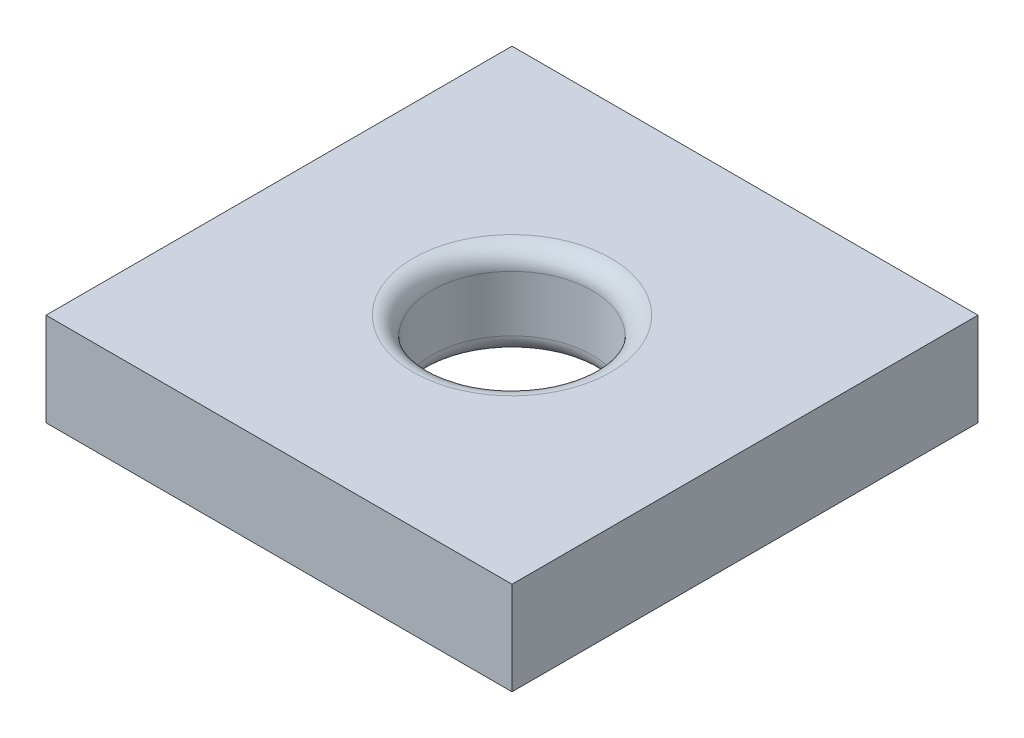
ISO-10303-21;
HEADER;
FILE_DESCRIPTION(('STEP AP214'),'2;1');
FILE_NAME('part.step','',(''),(''),'','','');
FILE_SCHEMA(('AUTOMOTIVE_DESIGN { 1 0 10303 214 1 1 1 1 }'));
ENDSEC;
DATA;
#1=APPLICATION_CONTEXT('core data for automotive mechanical design processes');
#2=APPLICATION_PROTOCOL_DEFINITION('international standard','automotive_design',2000,#1);
#3=PRODUCT_CONTEXT('',#1,'mechanical');
#4=PRODUCT('Part','Part','',(#3));
#5=PRODUCT_RELATED_PRODUCT_CATEGORY('part','',(#4));
#6=PRODUCT_DEFINITION_FORMATION('','',#4);
#7=PRODUCT_DEFINITION_CONTEXT('part definition',#1,'design');
#8=PRODUCT_DEFINITION('design','',#6,#7);
#9=PRODUCT_DEFINITION_SHAPE('','',#8);
#10=(LENGTH_UNIT() NAMED_UNIT(*) SI_UNIT(.MILLI.,.METRE.));
#11=(NAMED_UNIT(*) PLANE_ANGLE_UNIT() SI_UNIT($,.RADIAN.));
#12=(NAMED_UNIT(*) SI_UNIT($,.STERADIAN.) SOLID_ANGLE_UNIT());
#13=UNCERTAINTY_MEASURE_WITH_UNIT(LENGTH_MEASURE(1.E-05),#10,'distance_accuracy_value','');
#14=(GEOMETRIC_REPRESENTATION_CONTEXT(3) GLOBAL_UNCERTAINTY_ASSIGNED_CONTEXT((#13)) GLOBAL_UNIT_ASSIGNED_CONTEXT((#10,
#11,#12)) REPRESENTATION_CONTEXT('',''));
#15=CARTESIAN_POINT('',(0.,0.,0.));
#16=DIRECTION('',(0.,0.,1.));
#17=DIRECTION('',(1.,0.,0.));
#18=AXIS2_PLACEMENT_3D('',#15,#16,#17);
#19=CARTESIAN_POINT('',(-12.5,4.,-12.5));
#20=DIRECTION('',(0.,1.,0.));
#21=DIRECTION('',(0.,0.,1.));
#22=AXIS2_PLACEMENT_3D('',#19,#20,#21);
#23=TOROIDAL_SURFACE('',#22,5.3,1.);
#24=CARTESIAN_POINT('',(-12.5,5.,-12.5));
#25=DIRECTION('',(0.,1.,0.));
#26=DIRECTION('',(0.,0.,1.));
#27=AXIS2_PLACEMENT_3D('',#24,#25,#26);
#28=CIRCLE('',#27,5.3);
#29=CARTESIAN_POINT('',(-12.5,5.,-7.2));
#30=VERTEX_POINT('',#29);
#31=EDGE_CURVE('E46',#30,#30,#28,.F.);
#32=ORIENTED_EDGE('',*,*,#31,.F.);
#33=EDGE_LOOP('',(#32));
#34=FACE_BOUND('',#33,.T.);
#35=CARTESIAN_POINT('',(-12.5,4.,-12.5));
#36=DIRECTION('',(0.,1.,0.));
#37=DIRECTION('',(0.,0.,1.));
#38=AXIS2_PLACEMENT_3D('',#35,#36,#37);
#39=CIRCLE('',#38,4.3);
#40=CARTESIAN_POINT('',(-12.5,4.,-8.2));
#41=VERTEX_POINT('',#40);
#42=EDGE_CURVE('E11',#41,#41,#39,.T.);
#43=ORIENTED_EDGE('',*,*,#42,.F.);
#44=EDGE_LOOP('',(#43));
#45=FACE_BOUND('',#44,.T.);
#46=ADVANCED_FACE('F38',(#34,#45),#23,.T.);
#47=CARTESIAN_POINT('',(-12.5,1.,-12.5));
#48=DIRECTION('',(0.,1.,0.));
#49=DIRECTION('',(0.,0.,1.));
#50=AXIS2_PLACEMENT_3D('',#47,#48,#49);
#51=TOROIDAL_SURFACE('',#50,5.3,1.);
#52=CARTESIAN_POINT('',(-12.5,1.,-12.5));
#53=DIRECTION('',(0.,1.,0.));
#54=DIRECTION('',(0.,0.,1.));
#55=AXIS2_PLACEMENT_3D('',#52,#53,#54);
#56=CIRCLE('',#55,4.3);
#57=CARTESIAN_POINT('',(-12.5,1.,-8.2));
#58=VERTEX_POINT('',#57);
#59=EDGE_CURVE('E114',#58,#58,#56,.F.);
#60=ORIENTED_EDGE('',*,*,#59,.F.);
#61=EDGE_LOOP('',(#60));
#62=FACE_BOUND('',#61,.T.);
#63=CARTESIAN_POINT('',(-12.5,0.,-12.5));
#64=DIRECTION('',(0.,1.,0.));
#65=DIRECTION('',(0.,0.,1.));
#66=AXIS2_PLACEMENT_3D('',#63,#64,#65);
#67=CIRCLE('',#66,5.3);
#68=CARTESIAN_POINT('',(-12.5,0.,-7.2));
#69=VERTEX_POINT('',#68);
#70=EDGE_CURVE('E117',#69,#69,#67,.T.);
#71=ORIENTED_EDGE('',*,*,#70,.F.);
#72=EDGE_LOOP('',(#71));
#73=FACE_BOUND('',#72,.T.);
#74=ADVANCED_FACE('F125',(#62,#73),#51,.T.);
#75=CARTESIAN_POINT('',(-25.,5.,-25.));
#76=DIRECTION('',(1.,0.,0.));
#77=DIRECTION('',(0.,0.,-1.));
#78=AXIS2_PLACEMENT_3D('',#75,#76,#77);
#79=PLANE('',#78);
#80=DIRECTION('',(0.,0.,1.));
#81=VECTOR('',#80,1.);
#82=CARTESIAN_POINT('',(-25.,0.,-25.));
#83=LINE('',#82,#81);
#84=CARTESIAN_POINT('',(-25.,0.,-25.));
#85=VERTEX_POINT('',#84);
#86=CARTESIAN_POINT('',(-25.,0.,0.));
#87=VERTEX_POINT('',#86);
#88=EDGE_CURVE('E105',#85,#87,#83,.T.);
#89=ORIENTED_EDGE('',*,*,#88,.T.);
#90=DIRECTION('',(0.,-1.,0.));
#91=VECTOR('',#90,1.);
#92=CARTESIAN_POINT('',(-25.,5.,0.));
#93=LINE('',#92,#91);
#94=CARTESIAN_POINT('',(-25.,5.,0.));
#95=VERTEX_POINT('',#94);
#96=EDGE_CURVE('E96',#95,#87,#93,.T.);
#97=ORIENTED_EDGE('',*,*,#96,.F.);
#98=DIRECTION('',(0.,0.,1.));
#99=VECTOR('',#98,1.);
#100=CARTESIAN_POINT('',(-25.,5.,-25.));
#101=LINE('',#100,#99);
#102=CARTESIAN_POINT('',(-25.,5.,-25.));
#103=VERTEX_POINT('',#102);
#104=EDGE_CURVE('E90',#103,#95,#101,.T.);
#105=ORIENTED_EDGE('',*,*,#104,.F.);
#106=DIRECTION('',(0.,-1.,0.));
#107=VECTOR('',#106,1.);
#108=CARTESIAN_POINT('',(-25.,5.,-25.));
#109=LINE('',#108,#107);
#110=EDGE_CURVE('E101',#103,#85,#109,.T.);
#111=ORIENTED_EDGE('',*,*,#110,.T.);
#112=EDGE_LOOP('',(#89,#97,#105,#111));
#113=FACE_BOUND('',#112,.T.);
#114=ADVANCED_FACE('F137',(#113),#79,.F.);
#115=CARTESIAN_POINT('',(-25.,5.,0.));
#116=DIRECTION('',(0.,0.,-1.));
#117=DIRECTION('',(-1.,0.,0.));
#118=AXIS2_PLACEMENT_3D('',#115,#116,#117);
#119=PLANE('',#118);
#120=DIRECTION('',(1.,0.,0.));
#121=VECTOR('',#120,1.);
#122=CARTESIAN_POINT('',(-25.,0.,0.));
#123=LINE('',#122,#121);
#124=CARTESIAN_POINT('',(0.,0.,0.));
#125=VERTEX_POINT('',#124);
#126=EDGE_CURVE('E95',#87,#125,#123,.T.);
#127=ORIENTED_EDGE('',*,*,#126,.T.);
#128=DIRECTION('',(0.,-1.,0.));
#129=VECTOR('',#128,1.);
#130=CARTESIAN_POINT('',(0.,5.,0.));
#131=LINE('',#130,#129);
#132=CARTESIAN_POINT('',(0.,5.,0.));
#133=VERTEX_POINT('',#132);
#134=EDGE_CURVE('E93',#133,#125,#131,.T.);
#135=ORIENTED_EDGE('',*,*,#134,.F.);
#136=DIRECTION('',(1.,0.,0.));
#137=VECTOR('',#136,1.);
#138=CARTESIAN_POINT('',(-25.,5.,0.));
#139=LINE('',#138,#137);
#140=EDGE_CURVE('E85',#95,#133,#139,.T.);
#141=ORIENTED_EDGE('',*,*,#140,.F.);
#142=ORIENTED_EDGE('',*,*,#96,.T.);
#143=EDGE_LOOP('',(#127,#135,#141,#142));
#144=FACE_BOUND('',#143,.T.);
#145=ADVANCED_FACE('F94',(#144),#119,.F.);
#146=CARTESIAN_POINT('',(0.,5.,-25.));
#147=DIRECTION('',(-1.,0.,0.));
#148=DIRECTION('',(0.,0.,1.));
#149=AXIS2_PLACEMENT_3D('',#146,#147,#148);
#150=PLANE('',#149);
#151=DIRECTION('',(0.,0.,-1.));
#152=VECTOR('',#151,1.);
#153=CARTESIAN_POINT('',(0.,0.,-25.));
#154=LINE('',#153,#152);
#155=CARTESIAN_POINT('',(0.,0.,-25.));
#156=VERTEX_POINT('',#155);
#157=EDGE_CURVE('E71',#125,#156,#154,.T.);
#158=ORIENTED_EDGE('',*,*,#157,.T.);
#159=DIRECTION('',(0.,-1.,0.));
#160=VECTOR('',#159,1.);
#161=CARTESIAN_POINT('',(0.,5.,-25.));
#162=LINE('',#161,#160);
#163=CARTESIAN_POINT('',(0.,5.,-25.));
#164=VERTEX_POINT('',#163);
#165=EDGE_CURVE('E97',#164,#156,#162,.T.);
#166=ORIENTED_EDGE('',*,*,#165,.F.);
#167=DIRECTION('',(0.,0.,-1.));
#168=VECTOR('',#167,1.);
#169=CARTESIAN_POINT('',(0.,5.,-25.));
#170=LINE('',#169,#168);
#171=EDGE_CURVE('E88',#133,#164,#170,.T.);
#172=ORIENTED_EDGE('',*,*,#171,.F.);
#173=ORIENTED_EDGE('',*,*,#134,.T.);
#174=EDGE_LOOP('',(#158,#166,#172,#173));
#175=FACE_BOUND('',#174,.T.);
#176=ADVANCED_FACE('F99',(#175),#150,.F.);
#177=CARTESIAN_POINT('',(-25.,5.,-25.));
#178=DIRECTION('',(0.,0.,1.));
#179=DIRECTION('',(1.,0.,0.));
#180=AXIS2_PLACEMENT_3D('',#177,#178,#179);
#181=PLANE('',#180);
#182=DIRECTION('',(-1.,0.,0.));
#183=VECTOR('',#182,1.);
#184=CARTESIAN_POINT('',(-25.,0.,-25.));
#185=LINE('',#184,#183);
#186=EDGE_CURVE('E77',#156,#85,#185,.T.);
#187=ORIENTED_EDGE('',*,*,#186,.T.);
#188=ORIENTED_EDGE('',*,*,#110,.F.);
#189=DIRECTION('',(-1.,0.,0.));
#190=VECTOR('',#189,1.);
#191=CARTESIAN_POINT('',(-25.,5.,-25.));
#192=LINE('',#191,#190);
#193=EDGE_CURVE('E54',#164,#103,#192,.T.);
#194=ORIENTED_EDGE('',*,*,#193,.F.);
#195=ORIENTED_EDGE('',*,*,#165,.T.);
#196=EDGE_LOOP('',(#187,#188,#194,#195));
#197=FACE_BOUND('',#196,.T.);
#198=ADVANCED_FACE('F145',(#197),#181,.F.);
#199=CARTESIAN_POINT('',(0.,5.,0.));
#200=DIRECTION('',(0.,1.,0.));
#201=DIRECTION('',(0.,0.,1.));
#202=AXIS2_PLACEMENT_3D('',#199,#200,#201);
#203=PLANE('',#202);
#204=ORIENTED_EDGE('',*,*,#31,.T.);
#205=EDGE_LOOP('',(#204));
#206=FACE_BOUND('',#205,.T.);
#207=ORIENTED_EDGE('',*,*,#104,.T.);
#208=ORIENTED_EDGE('',*,*,#140,.T.);
#209=ORIENTED_EDGE('',*,*,#171,.T.);
#210=ORIENTED_EDGE('',*,*,#193,.T.);
#211=EDGE_LOOP('',(#207,#208,#209,#210));
#212=FACE_BOUND('',#211,.T.);
#213=ADVANCED_FACE('F86',(#206,#212),#203,.T.);
#214=CARTESIAN_POINT('',(0.,0.,0.));
#215=DIRECTION('',(0.,1.,0.));
#216=DIRECTION('',(0.,0.,1.));
#217=AXIS2_PLACEMENT_3D('',#214,#215,#216);
#218=PLANE('',#217);
#219=ORIENTED_EDGE('',*,*,#70,.T.);
#220=EDGE_LOOP('',(#219));
#221=FACE_BOUND('',#220,.T.);
#222=ORIENTED_EDGE('',*,*,#88,.F.);
#223=ORIENTED_EDGE('',*,*,#186,.F.);
#224=ORIENTED_EDGE('',*,*,#157,.F.);
#225=ORIENTED_EDGE('',*,*,#126,.F.);
#226=EDGE_LOOP('',(#222,#223,#224,#225));
#227=FACE_BOUND('',#226,.T.);
#228=ADVANCED_FACE('F131',(#221,#227),#218,.F.);
#229=CARTESIAN_POINT('',(-12.5,-0.00100000000000013,-12.5));
#230=DIRECTION('',(0.,1.,0.));
#231=DIRECTION('',(0.,0.,1.));
#232=AXIS2_PLACEMENT_3D('',#229,#230,#231);
#233=CYLINDRICAL_SURFACE('',#232,4.3);
#234=ORIENTED_EDGE('',*,*,#42,.T.);
#235=EDGE_LOOP('',(#234));
#236=FACE_BOUND('',#235,.T.);
#237=ORIENTED_EDGE('',*,*,#59,.T.);
#238=EDGE_LOOP('',(#237));
#239=FACE_BOUND('',#238,.T.);
#240=ADVANCED_FACE('F128',(#236,#239),#233,.F.);
#241=CLOSED_SHELL('',(#46,#74,#114,#145,#176,#198,#213,#228,#240));
#242=MANIFOLD_SOLID_BREP('B2',#241);
#243=ADVANCED_BREP_SHAPE_REPRESENTATION('',(#18,#242),#14);
#244=SHAPE_DEFINITION_REPRESENTATION(#9,#243);
ENDSEC;
END-ISO-10303-21;
